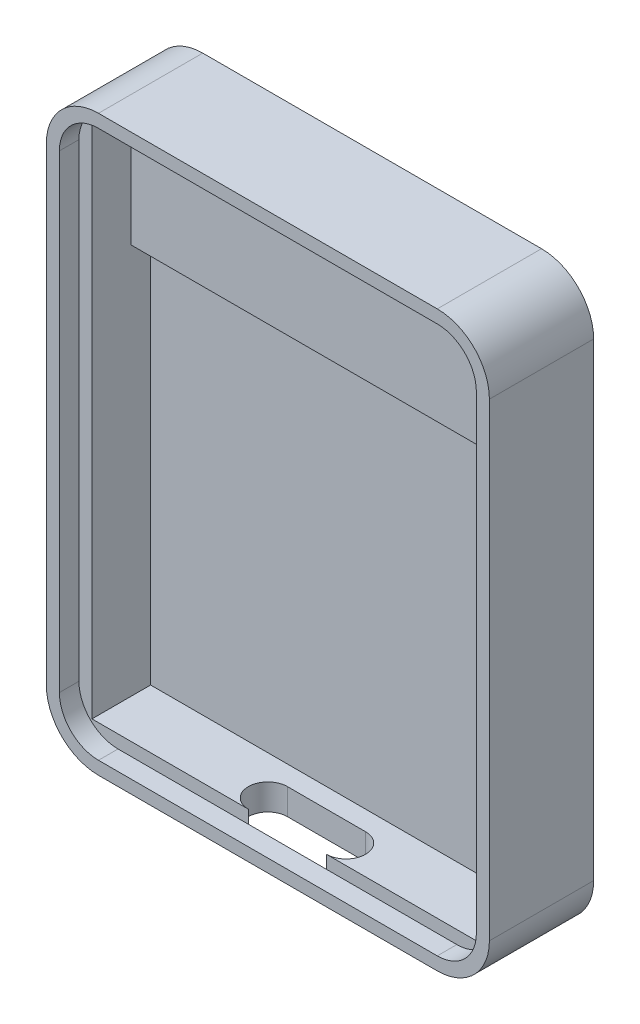
ISO-10303-21;
HEADER;
FILE_DESCRIPTION(('STEP AP214'),'2;1');
FILE_NAME('part.step','',(''),(''),'','','');
FILE_SCHEMA(('AUTOMOTIVE_DESIGN { 1 0 10303 214 1 1 1 1 }'));
ENDSEC;
DATA;
#1=APPLICATION_CONTEXT('core data for automotive mechanical design processes');
#2=APPLICATION_PROTOCOL_DEFINITION('international standard','automotive_design',2000,#1);
#3=PRODUCT_CONTEXT('',#1,'mechanical');
#4=PRODUCT('Part','Part','',(#3));
#5=PRODUCT_RELATED_PRODUCT_CATEGORY('part','',(#4));
#6=PRODUCT_DEFINITION_FORMATION('','',#4);
#7=PRODUCT_DEFINITION_CONTEXT('part definition',#1,'design');
#8=PRODUCT_DEFINITION('design','',#6,#7);
#9=PRODUCT_DEFINITION_SHAPE('','',#8);
#10=(LENGTH_UNIT() NAMED_UNIT(*) SI_UNIT(.MILLI.,.METRE.));
#11=(NAMED_UNIT(*) PLANE_ANGLE_UNIT() SI_UNIT($,.RADIAN.));
#12=(NAMED_UNIT(*) SI_UNIT($,.STERADIAN.) SOLID_ANGLE_UNIT());
#13=UNCERTAINTY_MEASURE_WITH_UNIT(LENGTH_MEASURE(1.E-05),#10,'distance_accuracy_value','');
#14=(GEOMETRIC_REPRESENTATION_CONTEXT(3) GLOBAL_UNCERTAINTY_ASSIGNED_CONTEXT((#13)) GLOBAL_UNIT_ASSIGNED_CONTEXT((#10,
#11,#12)) REPRESENTATION_CONTEXT('',''));
#15=CARTESIAN_POINT('',(0.,0.,0.));
#16=DIRECTION('',(0.,0.,1.));
#17=DIRECTION('',(1.,0.,0.));
#18=AXIS2_PLACEMENT_3D('',#15,#16,#17);
#19=CARTESIAN_POINT('',(17.,22.,8.));
#20=DIRECTION('',(-1.,0.,0.));
#21=DIRECTION('',(0.,-1.,0.));
#22=AXIS2_PLACEMENT_3D('',#19,#20,#21);
#23=PLANE('',#22);
#24=DIRECTION('',(0.,1.,0.));
#25=VECTOR('',#24,1.);
#26=CARTESIAN_POINT('',(17.,22.,8.));
#27=LINE('',#26,#25);
#28=CARTESIAN_POINT('',(17.,-18.,8.));
#29=VERTEX_POINT('',#28);
#30=CARTESIAN_POINT('',(17.,18.,8.));
#31=VERTEX_POINT('',#30);
#32=EDGE_CURVE('E370',#29,#31,#27,.T.);
#33=ORIENTED_EDGE('',*,*,#32,.F.);
#34=DIRECTION('',(0.,0.,-1.));
#35=VECTOR('',#34,1.);
#36=CARTESIAN_POINT('',(17.,-18.,8.));
#37=LINE('',#36,#35);
#38=CARTESIAN_POINT('',(17.,-18.,0.));
#39=VERTEX_POINT('',#38);
#40=EDGE_CURVE('E395',#29,#39,#37,.T.);
#41=ORIENTED_EDGE('',*,*,#40,.T.);
#42=DIRECTION('',(0.,1.,0.));
#43=VECTOR('',#42,1.);
#44=CARTESIAN_POINT('',(17.,22.,0.));
#45=LINE('',#44,#43);
#46=CARTESIAN_POINT('',(17.,18.,0.));
#47=VERTEX_POINT('',#46);
#48=EDGE_CURVE('E361',#39,#47,#45,.T.);
#49=ORIENTED_EDGE('',*,*,#48,.T.);
#50=DIRECTION('',(0.,0.,-1.));
#51=VECTOR('',#50,1.);
#52=CARTESIAN_POINT('',(17.,18.,8.));
#53=LINE('',#52,#51);
#54=EDGE_CURVE('E383',#47,#31,#53,.F.);
#55=ORIENTED_EDGE('',*,*,#54,.T.);
#56=EDGE_LOOP('',(#33,#41,#49,#55));
#57=FACE_BOUND('',#56,.T.);
#58=ADVANCED_FACE('F36',(#57),#23,.F.);
#59=CARTESIAN_POINT('',(-17.,22.,8.));
#60=DIRECTION('',(0.,-1.,0.));
#61=DIRECTION('',(0.,0.,-1.));
#62=AXIS2_PLACEMENT_3D('',#59,#60,#61);
#63=PLANE('',#62);
#64=DIRECTION('',(-1.,0.,0.));
#65=VECTOR('',#64,1.);
#66=CARTESIAN_POINT('',(-17.,22.,8.));
#67=LINE('',#66,#65);
#68=CARTESIAN_POINT('',(13.,22.,8.));
#69=VERTEX_POINT('',#68);
#70=CARTESIAN_POINT('',(-13.,22.,8.));
#71=VERTEX_POINT('',#70);
#72=EDGE_CURVE('E373',#69,#71,#67,.T.);
#73=ORIENTED_EDGE('',*,*,#72,.F.);
#74=DIRECTION('',(0.,0.,-1.));
#75=VECTOR('',#74,1.);
#76=CARTESIAN_POINT('',(13.,22.,8.));
#77=LINE('',#76,#75);
#78=CARTESIAN_POINT('',(13.,22.,0.));
#79=VERTEX_POINT('',#78);
#80=EDGE_CURVE('E421',#69,#79,#77,.T.);
#81=ORIENTED_EDGE('',*,*,#80,.T.);
#82=DIRECTION('',(-1.,0.,0.));
#83=VECTOR('',#82,1.);
#84=CARTESIAN_POINT('',(-17.,22.,0.));
#85=LINE('',#84,#83);
#86=CARTESIAN_POINT('',(-13.,22.,0.));
#87=VERTEX_POINT('',#86);
#88=EDGE_CURVE('E386',#79,#87,#85,.T.);
#89=ORIENTED_EDGE('',*,*,#88,.T.);
#90=DIRECTION('',(0.,0.,-1.));
#91=VECTOR('',#90,1.);
#92=CARTESIAN_POINT('',(-13.,22.,8.));
#93=LINE('',#92,#91);
#94=EDGE_CURVE('E419',#87,#71,#93,.F.);
#95=ORIENTED_EDGE('',*,*,#94,.T.);
#96=EDGE_LOOP('',(#73,#81,#89,#95));
#97=FACE_BOUND('',#96,.T.);
#98=ADVANCED_FACE('F457',(#97),#63,.F.);
#99=CARTESIAN_POINT('',(-17.,22.,8.));
#100=DIRECTION('',(1.,0.,0.));
#101=DIRECTION('',(0.,1.,0.));
#102=AXIS2_PLACEMENT_3D('',#99,#100,#101);
#103=PLANE('',#102);
#104=DIRECTION('',(0.,-1.,0.));
#105=VECTOR('',#104,1.);
#106=CARTESIAN_POINT('',(-17.,22.,8.));
#107=LINE('',#106,#105);
#108=CARTESIAN_POINT('',(-17.,18.,8.));
#109=VERTEX_POINT('',#108);
#110=CARTESIAN_POINT('',(-17.,-18.,8.));
#111=VERTEX_POINT('',#110);
#112=EDGE_CURVE('E377',#109,#111,#107,.T.);
#113=ORIENTED_EDGE('',*,*,#112,.F.);
#114=DIRECTION('',(0.,0.,-1.));
#115=VECTOR('',#114,1.);
#116=CARTESIAN_POINT('',(-17.,18.,8.));
#117=LINE('',#116,#115);
#118=CARTESIAN_POINT('',(-17.,18.,0.));
#119=VERTEX_POINT('',#118);
#120=EDGE_CURVE('E11',#109,#119,#117,.T.);
#121=ORIENTED_EDGE('',*,*,#120,.T.);
#122=DIRECTION('',(0.,-1.,0.));
#123=VECTOR('',#122,1.);
#124=CARTESIAN_POINT('',(-17.,22.,0.));
#125=LINE('',#124,#123);
#126=CARTESIAN_POINT('',(-17.,-18.,0.));
#127=VERTEX_POINT('',#126);
#128=EDGE_CURVE('E389',#119,#127,#125,.T.);
#129=ORIENTED_EDGE('',*,*,#128,.T.);
#130=DIRECTION('',(0.,0.,-1.));
#131=VECTOR('',#130,1.);
#132=CARTESIAN_POINT('',(-17.,-18.,8.));
#133=LINE('',#132,#131);
#134=EDGE_CURVE('E44',#127,#111,#133,.F.);
#135=ORIENTED_EDGE('',*,*,#134,.T.);
#136=EDGE_LOOP('',(#113,#121,#129,#135));
#137=FACE_BOUND('',#136,.T.);
#138=ADVANCED_FACE('F426',(#137),#103,.F.);
#139=CARTESIAN_POINT('',(-17.,-22.,8.));
#140=DIRECTION('',(0.,1.,0.));
#141=DIRECTION('',(0.,0.,1.));
#142=AXIS2_PLACEMENT_3D('',#139,#140,#141);
#143=PLANE('',#142);
#144=DIRECTION('',(1.,0.,0.));
#145=VECTOR('',#144,1.);
#146=CARTESIAN_POINT('',(-3.,-22.,3.5));
#147=LINE('',#146,#145);
#148=CARTESIAN_POINT('',(-3.,-22.,3.5));
#149=VERTEX_POINT('',#148);
#150=CARTESIAN_POINT('',(3.,-22.,3.5));
#151=VERTEX_POINT('',#150);
#152=EDGE_CURVE('E312',#149,#151,#147,.T.);
#153=ORIENTED_EDGE('',*,*,#152,.F.);
#154=CARTESIAN_POINT('',(-3.,-22.,5.));
#155=DIRECTION('',(0.,-1.,0.));
#156=DIRECTION('',(0.,0.,-1.));
#157=AXIS2_PLACEMENT_3D('',#154,#155,#156);
#158=CIRCLE('',#157,1.5);
#159=CARTESIAN_POINT('',(-3.,-22.,6.5));
#160=VERTEX_POINT('',#159);
#161=EDGE_CURVE('E59',#160,#149,#158,.T.);
#162=ORIENTED_EDGE('',*,*,#161,.F.);
#163=DIRECTION('',(-1.,0.,0.));
#164=VECTOR('',#163,1.);
#165=CARTESIAN_POINT('',(-3.,-22.,6.5));
#166=LINE('',#165,#164);
#167=CARTESIAN_POINT('',(3.,-22.,6.5));
#168=VERTEX_POINT('',#167);
#169=EDGE_CURVE('E304',#168,#160,#166,.T.);
#170=ORIENTED_EDGE('',*,*,#169,.F.);
#171=CARTESIAN_POINT('',(3.,-22.,5.));
#172=DIRECTION('',(0.,-1.,0.));
#173=DIRECTION('',(0.,0.,-1.));
#174=AXIS2_PLACEMENT_3D('',#171,#172,#173);
#175=CIRCLE('',#174,1.5);
#176=EDGE_CURVE('E315',#151,#168,#175,.T.);
#177=ORIENTED_EDGE('',*,*,#176,.F.);
#178=EDGE_LOOP('',(#153,#162,#170,#177));
#179=FACE_BOUND('',#178,.T.);
#180=DIRECTION('',(1.,0.,0.));
#181=VECTOR('',#180,1.);
#182=CARTESIAN_POINT('',(-17.,-22.,0.));
#183=LINE('',#182,#181);
#184=CARTESIAN_POINT('',(-13.,-22.,0.));
#185=VERTEX_POINT('',#184);
#186=CARTESIAN_POINT('',(13.,-22.,0.));
#187=VERTEX_POINT('',#186);
#188=EDGE_CURVE('E374',#185,#187,#183,.T.);
#189=ORIENTED_EDGE('',*,*,#188,.T.);
#190=DIRECTION('',(0.,0.,-1.));
#191=VECTOR('',#190,1.);
#192=CARTESIAN_POINT('',(13.,-22.,8.));
#193=LINE('',#192,#191);
#194=CARTESIAN_POINT('',(13.,-22.,8.));
#195=VERTEX_POINT('',#194);
#196=EDGE_CURVE('E409',#187,#195,#193,.F.);
#197=ORIENTED_EDGE('',*,*,#196,.T.);
#198=DIRECTION('',(1.,0.,0.));
#199=VECTOR('',#198,1.);
#200=CARTESIAN_POINT('',(-17.,-22.,8.));
#201=LINE('',#200,#199);
#202=CARTESIAN_POINT('',(-13.,-22.,8.));
#203=VERTEX_POINT('',#202);
#204=EDGE_CURVE('E380',#203,#195,#201,.T.);
#205=ORIENTED_EDGE('',*,*,#204,.F.);
#206=DIRECTION('',(0.,0.,-1.));
#207=VECTOR('',#206,1.);
#208=CARTESIAN_POINT('',(-13.,-22.,8.));
#209=LINE('',#208,#207);
#210=EDGE_CURVE('E406',#203,#185,#209,.T.);
#211=ORIENTED_EDGE('',*,*,#210,.T.);
#212=EDGE_LOOP('',(#189,#197,#205,#211));
#213=FACE_BOUND('',#212,.T.);
#214=ADVANCED_FACE('F438',(#179,#213),#143,.F.);
#215=CARTESIAN_POINT('',(0.,0.,8.));
#216=DIRECTION('',(0.,0.,1.));
#217=DIRECTION('',(1.,0.,0.));
#218=AXIS2_PLACEMENT_3D('',#215,#216,#217);
#219=PLANE('',#218);
#220=CARTESIAN_POINT('',(13.,18.,8.));
#221=DIRECTION('',(0.,0.,1.));
#222=DIRECTION('',(-1.,0.,0.));
#223=AXIS2_PLACEMENT_3D('',#220,#221,#222);
#224=CIRCLE('',#223,3.);
#225=CARTESIAN_POINT('',(16.,18.,8.));
#226=VERTEX_POINT('',#225);
#227=CARTESIAN_POINT('',(13.,21.,8.));
#228=VERTEX_POINT('',#227);
#229=EDGE_CURVE('E51',#226,#228,#224,.T.);
#230=ORIENTED_EDGE('',*,*,#229,.F.);
#231=DIRECTION('',(0.,1.,0.));
#232=VECTOR('',#231,1.);
#233=CARTESIAN_POINT('',(16.,-18.,8.));
#234=LINE('',#233,#232);
#235=CARTESIAN_POINT('',(16.,-18.,8.));
#236=VERTEX_POINT('',#235);
#237=EDGE_CURVE('E236',#236,#226,#234,.T.);
#238=ORIENTED_EDGE('',*,*,#237,.F.);
#239=CARTESIAN_POINT('',(13.,-18.,8.));
#240=DIRECTION('',(0.,0.,1.));
#241=DIRECTION('',(1.,0.,0.));
#242=AXIS2_PLACEMENT_3D('',#239,#240,#241);
#243=CIRCLE('',#242,3.);
#244=CARTESIAN_POINT('',(13.,-21.,8.));
#245=VERTEX_POINT('',#244);
#246=EDGE_CURVE('E239',#245,#236,#243,.T.);
#247=ORIENTED_EDGE('',*,*,#246,.F.);
#248=DIRECTION('',(1.,0.,0.));
#249=VECTOR('',#248,1.);
#250=CARTESIAN_POINT('',(-13.,-21.,8.));
#251=LINE('',#250,#249);
#252=CARTESIAN_POINT('',(-13.,-21.,8.));
#253=VERTEX_POINT('',#252);
#254=EDGE_CURVE('E269',#253,#245,#251,.T.);
#255=ORIENTED_EDGE('',*,*,#254,.F.);
#256=CARTESIAN_POINT('',(-13.,-18.,8.));
#257=DIRECTION('',(0.,0.,1.));
#258=DIRECTION('',(-1.,0.,0.));
#259=AXIS2_PLACEMENT_3D('',#256,#257,#258);
#260=CIRCLE('',#259,3.);
#261=CARTESIAN_POINT('',(-16.,-18.,8.));
#262=VERTEX_POINT('',#261);
#263=EDGE_CURVE('E266',#262,#253,#260,.T.);
#264=ORIENTED_EDGE('',*,*,#263,.F.);
#265=DIRECTION('',(0.,-1.,0.));
#266=VECTOR('',#265,1.);
#267=CARTESIAN_POINT('',(-16.,-18.,8.));
#268=LINE('',#267,#266);
#269=CARTESIAN_POINT('',(-16.,18.,8.));
#270=VERTEX_POINT('',#269);
#271=EDGE_CURVE('E263',#270,#262,#268,.T.);
#272=ORIENTED_EDGE('',*,*,#271,.F.);
#273=CARTESIAN_POINT('',(-13.,18.,8.));
#274=DIRECTION('',(0.,0.,1.));
#275=DIRECTION('',(1.,0.,0.));
#276=AXIS2_PLACEMENT_3D('',#273,#274,#275);
#277=CIRCLE('',#276,3.);
#278=CARTESIAN_POINT('',(-13.,21.,8.));
#279=VERTEX_POINT('',#278);
#280=EDGE_CURVE('E260',#279,#270,#277,.T.);
#281=ORIENTED_EDGE('',*,*,#280,.F.);
#282=DIRECTION('',(-1.,0.,0.));
#283=VECTOR('',#282,1.);
#284=CARTESIAN_POINT('',(-13.,21.,8.));
#285=LINE('',#284,#283);
#286=EDGE_CURVE('E258',#228,#279,#285,.T.);
#287=ORIENTED_EDGE('',*,*,#286,.F.);
#288=EDGE_LOOP('',(#230,#238,#247,#255,#264,#272,#281,#287));
#289=FACE_BOUND('',#288,.T.);
#290=ORIENTED_EDGE('',*,*,#204,.T.);
#291=CARTESIAN_POINT('',(13.,-18.,8.));
#292=DIRECTION('',(0.,0.,1.));
#293=DIRECTION('',(1.,0.,0.));
#294=AXIS2_PLACEMENT_3D('',#291,#292,#293);
#295=CIRCLE('',#294,4.);
#296=EDGE_CURVE('E417',#195,#29,#295,.T.);
#297=ORIENTED_EDGE('',*,*,#296,.T.);
#298=ORIENTED_EDGE('',*,*,#32,.T.);
#299=CARTESIAN_POINT('',(13.,18.,8.));
#300=DIRECTION('',(0.,0.,1.));
#301=DIRECTION('',(1.,0.,0.));
#302=AXIS2_PLACEMENT_3D('',#299,#300,#301);
#303=CIRCLE('',#302,4.);
#304=EDGE_CURVE('E415',#31,#69,#303,.T.);
#305=ORIENTED_EDGE('',*,*,#304,.T.);
#306=ORIENTED_EDGE('',*,*,#72,.T.);
#307=CARTESIAN_POINT('',(-13.,18.,8.));
#308=DIRECTION('',(0.,0.,1.));
#309=DIRECTION('',(1.,0.,0.));
#310=AXIS2_PLACEMENT_3D('',#307,#308,#309);
#311=CIRCLE('',#310,4.);
#312=EDGE_CURVE('E413',#71,#109,#311,.T.);
#313=ORIENTED_EDGE('',*,*,#312,.T.);
#314=ORIENTED_EDGE('',*,*,#112,.T.);
#315=CARTESIAN_POINT('',(-13.,-18.,8.));
#316=DIRECTION('',(0.,0.,1.));
#317=DIRECTION('',(1.,0.,0.));
#318=AXIS2_PLACEMENT_3D('',#315,#316,#317);
#319=CIRCLE('',#318,4.);
#320=EDGE_CURVE('E411',#111,#203,#319,.T.);
#321=ORIENTED_EDGE('',*,*,#320,.T.);
#322=EDGE_LOOP('',(#290,#297,#298,#305,#306,#313,#314,#321));
#323=FACE_BOUND('',#322,.T.);
#324=ADVANCED_FACE('F432',(#289,#323),#219,.T.);
#325=CARTESIAN_POINT('',(0.,0.,0.));
#326=DIRECTION('',(0.,0.,1.));
#327=DIRECTION('',(1.,0.,0.));
#328=AXIS2_PLACEMENT_3D('',#325,#326,#327);
#329=PLANE('',#328);
#330=ORIENTED_EDGE('',*,*,#48,.F.);
#331=CARTESIAN_POINT('',(13.,-18.,0.));
#332=DIRECTION('',(0.,0.,1.));
#333=DIRECTION('',(1.,0.,0.));
#334=AXIS2_PLACEMENT_3D('',#331,#332,#333);
#335=CIRCLE('',#334,4.);
#336=EDGE_CURVE('E404',#39,#187,#335,.F.);
#337=ORIENTED_EDGE('',*,*,#336,.T.);
#338=ORIENTED_EDGE('',*,*,#188,.F.);
#339=CARTESIAN_POINT('',(-13.,-18.,0.));
#340=DIRECTION('',(0.,0.,1.));
#341=DIRECTION('',(1.,0.,0.));
#342=AXIS2_PLACEMENT_3D('',#339,#340,#341);
#343=CIRCLE('',#342,4.);
#344=EDGE_CURVE('E398',#185,#127,#343,.F.);
#345=ORIENTED_EDGE('',*,*,#344,.T.);
#346=ORIENTED_EDGE('',*,*,#128,.F.);
#347=CARTESIAN_POINT('',(-13.,18.,0.));
#348=DIRECTION('',(0.,0.,1.));
#349=DIRECTION('',(1.,0.,0.));
#350=AXIS2_PLACEMENT_3D('',#347,#348,#349);
#351=CIRCLE('',#350,4.);
#352=EDGE_CURVE('E400',#119,#87,#351,.F.);
#353=ORIENTED_EDGE('',*,*,#352,.T.);
#354=ORIENTED_EDGE('',*,*,#88,.F.);
#355=CARTESIAN_POINT('',(13.,18.,0.));
#356=DIRECTION('',(0.,0.,1.));
#357=DIRECTION('',(1.,0.,0.));
#358=AXIS2_PLACEMENT_3D('',#355,#356,#357);
#359=CIRCLE('',#358,4.);
#360=EDGE_CURVE('E402',#79,#47,#359,.F.);
#361=ORIENTED_EDGE('',*,*,#360,.T.);
#362=EDGE_LOOP('',(#330,#337,#338,#345,#346,#353,#354,#361));
#363=FACE_BOUND('',#362,.T.);
#364=ADVANCED_FACE('F442',(#363),#329,.F.);
#365=CARTESIAN_POINT('',(15.,20.,3.5));
#366=DIRECTION('',(1.,0.,0.));
#367=DIRECTION('',(0.,1.,0.));
#368=AXIS2_PLACEMENT_3D('',#365,#366,#367);
#369=PLANE('',#368);
#370=DIRECTION('',(0.,0.,1.));
#371=VECTOR('',#370,1.);
#372=CARTESIAN_POINT('',(15.,-20.,3.5));
#373=LINE('',#372,#371);
#374=CARTESIAN_POINT('',(15.,-20.,2.));
#375=VERTEX_POINT('',#374);
#376=CARTESIAN_POINT('',(15.,-20.,6.5));
#377=VERTEX_POINT('',#376);
#378=EDGE_CURVE('E358',#375,#377,#373,.T.);
#379=ORIENTED_EDGE('',*,*,#378,.T.);
#380=DIRECTION('',(0.,1.,0.));
#381=VECTOR('',#380,1.);
#382=CARTESIAN_POINT('',(15.,20.,6.5));
#383=LINE('',#382,#381);
#384=CARTESIAN_POINT('',(15.,20.,6.5));
#385=VERTEX_POINT('',#384);
#386=EDGE_CURVE('E290',#377,#385,#383,.T.);
#387=ORIENTED_EDGE('',*,*,#386,.T.);
#388=DIRECTION('',(0.,0.,1.));
#389=VECTOR('',#388,1.);
#390=CARTESIAN_POINT('',(15.,20.,3.5));
#391=LINE('',#390,#389);
#392=CARTESIAN_POINT('',(15.,20.,3.5));
#393=VERTEX_POINT('',#392);
#394=EDGE_CURVE('E357',#393,#385,#391,.T.);
#395=ORIENTED_EDGE('',*,*,#394,.F.);
#396=DIRECTION('',(0.,1.,0.));
#397=VECTOR('',#396,1.);
#398=CARTESIAN_POINT('',(15.,20.,3.5));
#399=LINE('',#398,#397);
#400=CARTESIAN_POINT('',(15.,10.,3.5));
#401=VERTEX_POINT('',#400);
#402=EDGE_CURVE('E348',#401,#393,#399,.T.);
#403=ORIENTED_EDGE('',*,*,#402,.F.);
#404=DIRECTION('',(0.,0.,1.));
#405=VECTOR('',#404,1.);
#406=CARTESIAN_POINT('',(15.,10.,2.));
#407=LINE('',#406,#405);
#408=CARTESIAN_POINT('',(15.,10.,2.));
#409=VERTEX_POINT('',#408);
#410=EDGE_CURVE('E343',#409,#401,#407,.T.);
#411=ORIENTED_EDGE('',*,*,#410,.F.);
#412=DIRECTION('',(0.,1.,0.));
#413=VECTOR('',#412,1.);
#414=CARTESIAN_POINT('',(15.,10.,2.));
#415=LINE('',#414,#413);
#416=EDGE_CURVE('E337',#375,#409,#415,.T.);
#417=ORIENTED_EDGE('',*,*,#416,.F.);
#418=EDGE_LOOP('',(#379,#387,#395,#403,#411,#417));
#419=FACE_BOUND('',#418,.T.);
#420=ADVANCED_FACE('F501',(#419),#369,.F.);
#421=CARTESIAN_POINT('',(-15.,-20.,3.5));
#422=DIRECTION('',(0.,-1.,0.));
#423=DIRECTION('',(0.,0.,-1.));
#424=AXIS2_PLACEMENT_3D('',#421,#422,#423);
#425=PLANE('',#424);
#426=DIRECTION('',(0.,0.,1.));
#427=VECTOR('',#426,1.);
#428=CARTESIAN_POINT('',(-15.,-20.,3.5));
#429=LINE('',#428,#427);
#430=CARTESIAN_POINT('',(-15.,-20.,2.));
#431=VERTEX_POINT('',#430);
#432=CARTESIAN_POINT('',(-15.,-20.,6.5));
#433=VERTEX_POINT('',#432);
#434=EDGE_CURVE('E362',#431,#433,#429,.T.);
#435=ORIENTED_EDGE('',*,*,#434,.T.);
#436=DIRECTION('',(1.,0.,0.));
#437=VECTOR('',#436,1.);
#438=CARTESIAN_POINT('',(-15.,-20.,6.5));
#439=LINE('',#438,#437);
#440=CARTESIAN_POINT('',(-3.,-20.,6.5));
#441=VERTEX_POINT('',#440);
#442=EDGE_CURVE('E291',#433,#441,#439,.T.);
#443=ORIENTED_EDGE('',*,*,#442,.T.);
#444=CARTESIAN_POINT('',(-3.,-20.,5.));
#445=DIRECTION('',(0.,-1.,0.));
#446=DIRECTION('',(0.,0.,-1.));
#447=AXIS2_PLACEMENT_3D('',#444,#445,#446);
#448=CIRCLE('',#447,1.5);
#449=CARTESIAN_POINT('',(-3.,-20.,3.5));
#450=VERTEX_POINT('',#449);
#451=EDGE_CURVE('E300',#441,#450,#448,.T.);
#452=ORIENTED_EDGE('',*,*,#451,.T.);
#453=DIRECTION('',(1.,0.,0.));
#454=VECTOR('',#453,1.);
#455=CARTESIAN_POINT('',(-3.,-20.,3.5));
#456=LINE('',#455,#454);
#457=CARTESIAN_POINT('',(3.,-20.,3.5));
#458=VERTEX_POINT('',#457);
#459=EDGE_CURVE('E303',#450,#458,#456,.T.);
#460=ORIENTED_EDGE('',*,*,#459,.T.);
#461=CARTESIAN_POINT('',(3.,-20.,5.));
#462=DIRECTION('',(0.,-1.,0.));
#463=DIRECTION('',(0.,0.,-1.));
#464=AXIS2_PLACEMENT_3D('',#461,#462,#463);
#465=CIRCLE('',#464,1.5);
#466=CARTESIAN_POINT('',(3.,-20.,6.5));
#467=VERTEX_POINT('',#466);
#468=EDGE_CURVE('E307',#458,#467,#465,.T.);
#469=ORIENTED_EDGE('',*,*,#468,.T.);
#470=EDGE_CURVE('E276',#467,#377,#439,.T.);
#471=ORIENTED_EDGE('',*,*,#470,.T.);
#472=ORIENTED_EDGE('',*,*,#378,.F.);
#473=DIRECTION('',(1.,0.,0.));
#474=VECTOR('',#473,1.);
#475=CARTESIAN_POINT('',(15.,-20.,2.));
#476=LINE('',#475,#474);
#477=EDGE_CURVE('E334',#431,#375,#476,.T.);
#478=ORIENTED_EDGE('',*,*,#477,.F.);
#479=EDGE_LOOP('',(#435,#443,#452,#460,#469,#471,#472,#478));
#480=FACE_BOUND('',#479,.T.);
#481=ADVANCED_FACE('F497',(#480),#425,.F.);
#482=CARTESIAN_POINT('',(-15.,20.,3.5));
#483=DIRECTION('',(-1.,0.,0.));
#484=DIRECTION('',(0.,-1.,0.));
#485=AXIS2_PLACEMENT_3D('',#482,#483,#484);
#486=PLANE('',#485);
#487=DIRECTION('',(0.,0.,1.));
#488=VECTOR('',#487,1.);
#489=CARTESIAN_POINT('',(-15.,20.,3.5));
#490=LINE('',#489,#488);
#491=CARTESIAN_POINT('',(-15.,20.,3.5));
#492=VERTEX_POINT('',#491);
#493=CARTESIAN_POINT('',(-15.,20.,6.5));
#494=VERTEX_POINT('',#493);
#495=EDGE_CURVE('E365',#492,#494,#490,.T.);
#496=ORIENTED_EDGE('',*,*,#495,.T.);
#497=DIRECTION('',(0.,-1.,0.));
#498=VECTOR('',#497,1.);
#499=CARTESIAN_POINT('',(-15.,20.,6.5));
#500=LINE('',#499,#498);
#501=EDGE_CURVE('E297',#494,#433,#500,.T.);
#502=ORIENTED_EDGE('',*,*,#501,.T.);
#503=ORIENTED_EDGE('',*,*,#434,.F.);
#504=DIRECTION('',(0.,-1.,0.));
#505=VECTOR('',#504,1.);
#506=CARTESIAN_POINT('',(-15.,10.,2.));
#507=LINE('',#506,#505);
#508=CARTESIAN_POINT('',(-15.,10.,2.));
#509=VERTEX_POINT('',#508);
#510=EDGE_CURVE('E331',#509,#431,#507,.T.);
#511=ORIENTED_EDGE('',*,*,#510,.F.);
#512=DIRECTION('',(0.,0.,1.));
#513=VECTOR('',#512,1.);
#514=CARTESIAN_POINT('',(-15.,10.,2.));
#515=LINE('',#514,#513);
#516=CARTESIAN_POINT('',(-15.,10.,3.5));
#517=VERTEX_POINT('',#516);
#518=EDGE_CURVE('E346',#509,#517,#515,.T.);
#519=ORIENTED_EDGE('',*,*,#518,.T.);
#520=DIRECTION('',(0.,-1.,0.));
#521=VECTOR('',#520,1.);
#522=CARTESIAN_POINT('',(-15.,20.,3.5));
#523=LINE('',#522,#521);
#524=EDGE_CURVE('E354',#492,#517,#523,.T.);
#525=ORIENTED_EDGE('',*,*,#524,.F.);
#526=EDGE_LOOP('',(#496,#502,#503,#511,#519,#525));
#527=FACE_BOUND('',#526,.T.);
#528=ADVANCED_FACE('F500',(#527),#486,.F.);
#529=CARTESIAN_POINT('',(-15.,20.,3.5));
#530=DIRECTION('',(0.,1.,0.));
#531=DIRECTION('',(0.,0.,1.));
#532=AXIS2_PLACEMENT_3D('',#529,#530,#531);
#533=PLANE('',#532);
#534=ORIENTED_EDGE('',*,*,#394,.T.);
#535=DIRECTION('',(-1.,0.,0.));
#536=VECTOR('',#535,1.);
#537=CARTESIAN_POINT('',(-15.,20.,6.5));
#538=LINE('',#537,#536);
#539=EDGE_CURVE('E294',#385,#494,#538,.T.);
#540=ORIENTED_EDGE('',*,*,#539,.T.);
#541=ORIENTED_EDGE('',*,*,#495,.F.);
#542=DIRECTION('',(-1.,0.,0.));
#543=VECTOR('',#542,1.);
#544=CARTESIAN_POINT('',(-15.,20.,3.5));
#545=LINE('',#544,#543);
#546=EDGE_CURVE('E351',#393,#492,#545,.T.);
#547=ORIENTED_EDGE('',*,*,#546,.F.);
#548=EDGE_LOOP('',(#534,#540,#541,#547));
#549=FACE_BOUND('',#548,.T.);
#550=ADVANCED_FACE('F495',(#549),#533,.F.);
#551=CARTESIAN_POINT('',(0.,0.,3.5));
#552=DIRECTION('',(0.,0.,1.));
#553=DIRECTION('',(1.,0.,0.));
#554=AXIS2_PLACEMENT_3D('',#551,#552,#553);
#555=PLANE('',#554);
#556=DIRECTION('',(-1.,0.,0.));
#557=VECTOR('',#556,1.);
#558=CARTESIAN_POINT('',(15.,10.,3.5));
#559=LINE('',#558,#557);
#560=EDGE_CURVE('E323',#401,#517,#559,.T.);
#561=ORIENTED_EDGE('',*,*,#560,.F.);
#562=ORIENTED_EDGE('',*,*,#402,.T.);
#563=ORIENTED_EDGE('',*,*,#546,.T.);
#564=ORIENTED_EDGE('',*,*,#524,.T.);
#565=EDGE_LOOP('',(#561,#562,#563,#564));
#566=FACE_BOUND('',#565,.T.);
#567=ADVANCED_FACE('F487',(#566),#555,.T.);
#568=CARTESIAN_POINT('',(15.,10.,2.));
#569=DIRECTION('',(0.,1.,0.));
#570=DIRECTION('',(0.,0.,1.));
#571=AXIS2_PLACEMENT_3D('',#568,#569,#570);
#572=PLANE('',#571);
#573=ORIENTED_EDGE('',*,*,#560,.T.);
#574=ORIENTED_EDGE('',*,*,#518,.F.);
#575=DIRECTION('',(-1.,0.,0.));
#576=VECTOR('',#575,1.);
#577=CARTESIAN_POINT('',(15.,10.,2.));
#578=LINE('',#577,#576);
#579=EDGE_CURVE('E340',#409,#509,#578,.T.);
#580=ORIENTED_EDGE('',*,*,#579,.F.);
#581=ORIENTED_EDGE('',*,*,#410,.T.);
#582=EDGE_LOOP('',(#573,#574,#580,#581));
#583=FACE_BOUND('',#582,.T.);
#584=ADVANCED_FACE('F481',(#583),#572,.F.);
#585=CARTESIAN_POINT('',(0.,0.,2.));
#586=DIRECTION('',(0.,0.,-1.));
#587=DIRECTION('',(-1.,0.,0.));
#588=AXIS2_PLACEMENT_3D('',#585,#586,#587);
#589=PLANE('',#588);
#590=ORIENTED_EDGE('',*,*,#510,.T.);
#591=ORIENTED_EDGE('',*,*,#477,.T.);
#592=ORIENTED_EDGE('',*,*,#416,.T.);
#593=ORIENTED_EDGE('',*,*,#579,.T.);
#594=EDGE_LOOP('',(#590,#591,#592,#593));
#595=FACE_BOUND('',#594,.T.);
#596=ADVANCED_FACE('F477',(#595),#589,.F.);
#597=CARTESIAN_POINT('',(13.,-18.,8.));
#598=DIRECTION('',(0.,0.,-1.));
#599=DIRECTION('',(-1.,0.,0.));
#600=AXIS2_PLACEMENT_3D('',#597,#598,#599);
#601=CYLINDRICAL_SURFACE('',#600,4.);
#602=ORIENTED_EDGE('',*,*,#296,.F.);
#603=ORIENTED_EDGE('',*,*,#196,.F.);
#604=ORIENTED_EDGE('',*,*,#336,.F.);
#605=ORIENTED_EDGE('',*,*,#40,.F.);
#606=EDGE_LOOP('',(#602,#603,#604,#605));
#607=FACE_BOUND('',#606,.T.);
#608=ADVANCED_FACE('F446',(#607),#601,.T.);
#609=CARTESIAN_POINT('',(13.,18.,8.));
#610=DIRECTION('',(0.,0.,-1.));
#611=DIRECTION('',(-1.,0.,0.));
#612=AXIS2_PLACEMENT_3D('',#609,#610,#611);
#613=CYLINDRICAL_SURFACE('',#612,4.);
#614=ORIENTED_EDGE('',*,*,#304,.F.);
#615=ORIENTED_EDGE('',*,*,#54,.F.);
#616=ORIENTED_EDGE('',*,*,#360,.F.);
#617=ORIENTED_EDGE('',*,*,#80,.F.);
#618=EDGE_LOOP('',(#614,#615,#616,#617));
#619=FACE_BOUND('',#618,.T.);
#620=ADVANCED_FACE('F454',(#619),#613,.T.);
#621=CARTESIAN_POINT('',(-13.,18.,8.));
#622=DIRECTION('',(0.,0.,-1.));
#623=DIRECTION('',(-1.,0.,0.));
#624=AXIS2_PLACEMENT_3D('',#621,#622,#623);
#625=CYLINDRICAL_SURFACE('',#624,4.);
#626=ORIENTED_EDGE('',*,*,#312,.F.);
#627=ORIENTED_EDGE('',*,*,#94,.F.);
#628=ORIENTED_EDGE('',*,*,#352,.F.);
#629=ORIENTED_EDGE('',*,*,#120,.F.);
#630=EDGE_LOOP('',(#626,#627,#628,#629));
#631=FACE_BOUND('',#630,.T.);
#632=ADVANCED_FACE('F460',(#631),#625,.T.);
#633=CARTESIAN_POINT('',(-13.,-18.,8.));
#634=DIRECTION('',(0.,0.,-1.));
#635=DIRECTION('',(-1.,0.,0.));
#636=AXIS2_PLACEMENT_3D('',#633,#634,#635);
#637=CYLINDRICAL_SURFACE('',#636,4.);
#638=ORIENTED_EDGE('',*,*,#320,.F.);
#639=ORIENTED_EDGE('',*,*,#134,.F.);
#640=ORIENTED_EDGE('',*,*,#344,.F.);
#641=ORIENTED_EDGE('',*,*,#210,.F.);
#642=EDGE_LOOP('',(#638,#639,#640,#641));
#643=FACE_BOUND('',#642,.T.);
#644=ADVANCED_FACE('F38',(#643),#637,.T.);
#645=CARTESIAN_POINT('',(-3.,-20.,5.));
#646=DIRECTION('',(0.,-1.,0.));
#647=DIRECTION('',(0.,0.,-1.));
#648=AXIS2_PLACEMENT_3D('',#645,#646,#647);
#649=CYLINDRICAL_SURFACE('',#648,1.5);
#650=ORIENTED_EDGE('',*,*,#161,.T.);
#651=DIRECTION('',(0.,-1.,0.));
#652=VECTOR('',#651,1.);
#653=CARTESIAN_POINT('',(-3.,-20.,3.5));
#654=LINE('',#653,#652);
#655=EDGE_CURVE('E310',#450,#149,#654,.T.);
#656=ORIENTED_EDGE('',*,*,#655,.F.);
#657=ORIENTED_EDGE('',*,*,#451,.F.);
#658=DIRECTION('',(0.,-1.,0.));
#659=VECTOR('',#658,1.);
#660=CARTESIAN_POINT('',(-3.,-20.,6.5));
#661=LINE('',#660,#659);
#662=CARTESIAN_POINT('',(-3.,-21.,6.5));
#663=VERTEX_POINT('',#662);
#664=EDGE_CURVE('E320',#441,#663,#661,.T.);
#665=ORIENTED_EDGE('',*,*,#664,.T.);
#666=EDGE_CURVE('E324',#663,#160,#661,.T.);
#667=ORIENTED_EDGE('',*,*,#666,.T.);
#668=EDGE_LOOP('',(#650,#656,#657,#665,#667));
#669=FACE_BOUND('',#668,.T.);
#670=ADVANCED_FACE('F466',(#669),#649,.F.);
#671=CARTESIAN_POINT('',(-3.,-20.,6.5));
#672=DIRECTION('',(0.,0.,1.));
#673=DIRECTION('',(1.,0.,0.));
#674=AXIS2_PLACEMENT_3D('',#671,#672,#673);
#675=PLANE('',#674);
#676=ORIENTED_EDGE('',*,*,#666,.F.);
#677=DIRECTION('',(1.,0.,0.));
#678=VECTOR('',#677,1.);
#679=CARTESIAN_POINT('',(-13.,-21.,6.5));
#680=LINE('',#679,#678);
#681=CARTESIAN_POINT('',(3.,-21.,6.5));
#682=VERTEX_POINT('',#681);
#683=EDGE_CURVE('E254',#663,#682,#680,.T.);
#684=ORIENTED_EDGE('',*,*,#683,.T.);
#685=DIRECTION('',(0.,-1.,0.));
#686=VECTOR('',#685,1.);
#687=CARTESIAN_POINT('',(3.,-20.,6.5));
#688=LINE('',#687,#686);
#689=EDGE_CURVE('E327',#682,#168,#688,.T.);
#690=ORIENTED_EDGE('',*,*,#689,.T.);
#691=ORIENTED_EDGE('',*,*,#169,.T.);
#692=EDGE_LOOP('',(#676,#684,#690,#691));
#693=FACE_BOUND('',#692,.T.);
#694=ADVANCED_FACE('F628',(#693),#675,.F.);
#695=CARTESIAN_POINT('',(3.,-20.,5.));
#696=DIRECTION('',(0.,-1.,0.));
#697=DIRECTION('',(0.,0.,-1.));
#698=AXIS2_PLACEMENT_3D('',#695,#696,#697);
#699=CYLINDRICAL_SURFACE('',#698,1.5);
#700=ORIENTED_EDGE('',*,*,#176,.T.);
#701=ORIENTED_EDGE('',*,*,#689,.F.);
#702=EDGE_CURVE('E325',#467,#682,#688,.T.);
#703=ORIENTED_EDGE('',*,*,#702,.F.);
#704=ORIENTED_EDGE('',*,*,#468,.F.);
#705=DIRECTION('',(0.,-1.,0.));
#706=VECTOR('',#705,1.);
#707=CARTESIAN_POINT('',(3.,-20.,3.5));
#708=LINE('',#707,#706);
#709=EDGE_CURVE('E328',#458,#151,#708,.T.);
#710=ORIENTED_EDGE('',*,*,#709,.T.);
#711=EDGE_LOOP('',(#700,#701,#703,#704,#710));
#712=FACE_BOUND('',#711,.T.);
#713=ADVANCED_FACE('F635',(#712),#699,.F.);
#714=CARTESIAN_POINT('',(-3.,-20.,3.5));
#715=DIRECTION('',(0.,0.,-1.));
#716=DIRECTION('',(-1.,0.,0.));
#717=AXIS2_PLACEMENT_3D('',#714,#715,#716);
#718=PLANE('',#717);
#719=ORIENTED_EDGE('',*,*,#152,.T.);
#720=ORIENTED_EDGE('',*,*,#709,.F.);
#721=ORIENTED_EDGE('',*,*,#459,.F.);
#722=ORIENTED_EDGE('',*,*,#655,.T.);
#723=EDGE_LOOP('',(#719,#720,#721,#722));
#724=FACE_BOUND('',#723,.T.);
#725=ADVANCED_FACE('F644',(#724),#718,.F.);
#726=CARTESIAN_POINT('',(13.,18.,6.5));
#727=DIRECTION('',(0.,0.,1.));
#728=DIRECTION('',(1.,0.,0.));
#729=AXIS2_PLACEMENT_3D('',#726,#727,#728);
#730=CYLINDRICAL_SURFACE('',#729,3.);
#731=ORIENTED_EDGE('',*,*,#229,.T.);
#732=DIRECTION('',(0.,0.,1.));
#733=VECTOR('',#732,1.);
#734=CARTESIAN_POINT('',(13.,21.,6.5));
#735=LINE('',#734,#733);
#736=CARTESIAN_POINT('',(13.,21.,6.5));
#737=VERTEX_POINT('',#736);
#738=EDGE_CURVE('E213',#737,#228,#735,.T.);
#739=ORIENTED_EDGE('',*,*,#738,.F.);
#740=CARTESIAN_POINT('',(13.,18.,6.5));
#741=DIRECTION('',(0.,0.,1.));
#742=DIRECTION('',(-1.,0.,0.));
#743=AXIS2_PLACEMENT_3D('',#740,#741,#742);
#744=CIRCLE('',#743,3.);
#745=CARTESIAN_POINT('',(16.,18.,6.5));
#746=VERTEX_POINT('',#745);
#747=EDGE_CURVE('E217',#746,#737,#744,.T.);
#748=ORIENTED_EDGE('',*,*,#747,.F.);
#749=DIRECTION('',(0.,0.,1.));
#750=VECTOR('',#749,1.);
#751=CARTESIAN_POINT('',(16.,18.,6.5));
#752=LINE('',#751,#750);
#753=EDGE_CURVE('E274',#746,#226,#752,.T.);
#754=ORIENTED_EDGE('',*,*,#753,.T.);
#755=EDGE_LOOP('',(#731,#739,#748,#754));
#756=FACE_BOUND('',#755,.T.);
#757=ADVANCED_FACE('F215',(#756),#730,.F.);
#758=CARTESIAN_POINT('',(16.,-18.,6.5));
#759=DIRECTION('',(1.,0.,0.));
#760=DIRECTION('',(0.,0.,-1.));
#761=AXIS2_PLACEMENT_3D('',#758,#759,#760);
#762=PLANE('',#761);
#763=ORIENTED_EDGE('',*,*,#237,.T.);
#764=ORIENTED_EDGE('',*,*,#753,.F.);
#765=DIRECTION('',(0.,1.,0.));
#766=VECTOR('',#765,1.);
#767=CARTESIAN_POINT('',(16.,-18.,6.5));
#768=LINE('',#767,#766);
#769=CARTESIAN_POINT('',(16.,-18.,6.5));
#770=VERTEX_POINT('',#769);
#771=EDGE_CURVE('E223',#770,#746,#768,.T.);
#772=ORIENTED_EDGE('',*,*,#771,.F.);
#773=DIRECTION('',(0.,0.,1.));
#774=VECTOR('',#773,1.);
#775=CARTESIAN_POINT('',(16.,-18.,6.5));
#776=LINE('',#775,#774);
#777=EDGE_CURVE('E277',#770,#236,#776,.T.);
#778=ORIENTED_EDGE('',*,*,#777,.T.);
#779=EDGE_LOOP('',(#763,#764,#772,#778));
#780=FACE_BOUND('',#779,.T.);
#781=ADVANCED_FACE('F659',(#780),#762,.F.);
#782=CARTESIAN_POINT('',(13.,-18.,6.5));
#783=DIRECTION('',(0.,0.,1.));
#784=DIRECTION('',(1.,0.,0.));
#785=AXIS2_PLACEMENT_3D('',#782,#783,#784);
#786=CYLINDRICAL_SURFACE('',#785,3.);
#787=ORIENTED_EDGE('',*,*,#246,.T.);
#788=ORIENTED_EDGE('',*,*,#777,.F.);
#789=CARTESIAN_POINT('',(13.,-18.,6.5));
#790=DIRECTION('',(0.,0.,1.));
#791=DIRECTION('',(1.,0.,0.));
#792=AXIS2_PLACEMENT_3D('',#789,#790,#791);
#793=CIRCLE('',#792,3.);
#794=CARTESIAN_POINT('',(13.,-21.,6.5));
#795=VERTEX_POINT('',#794);
#796=EDGE_CURVE('E253',#795,#770,#793,.T.);
#797=ORIENTED_EDGE('',*,*,#796,.F.);
#798=DIRECTION('',(0.,0.,1.));
#799=VECTOR('',#798,1.);
#800=CARTESIAN_POINT('',(13.,-21.,6.5));
#801=LINE('',#800,#799);
#802=EDGE_CURVE('E279',#795,#245,#801,.T.);
#803=ORIENTED_EDGE('',*,*,#802,.T.);
#804=EDGE_LOOP('',(#787,#788,#797,#803));
#805=FACE_BOUND('',#804,.T.);
#806=ADVANCED_FACE('F667',(#805),#786,.F.);
#807=CARTESIAN_POINT('',(-13.,-21.,6.5));
#808=DIRECTION('',(0.,-1.,0.));
#809=DIRECTION('',(0.,0.,-1.));
#810=AXIS2_PLACEMENT_3D('',#807,#808,#809);
#811=PLANE('',#810);
#812=ORIENTED_EDGE('',*,*,#254,.T.);
#813=ORIENTED_EDGE('',*,*,#802,.F.);
#814=EDGE_CURVE('E249',#682,#795,#680,.T.);
#815=ORIENTED_EDGE('',*,*,#814,.F.);
#816=ORIENTED_EDGE('',*,*,#683,.F.);
#817=CARTESIAN_POINT('',(-13.,-21.,6.5));
#818=VERTEX_POINT('',#817);
#819=EDGE_CURVE('E250',#818,#663,#680,.T.);
#820=ORIENTED_EDGE('',*,*,#819,.F.);
#821=DIRECTION('',(0.,0.,1.));
#822=VECTOR('',#821,1.);
#823=CARTESIAN_POINT('',(-13.,-21.,6.5));
#824=LINE('',#823,#822);
#825=EDGE_CURVE('E281',#818,#253,#824,.T.);
#826=ORIENTED_EDGE('',*,*,#825,.T.);
#827=EDGE_LOOP('',(#812,#813,#815,#816,#820,#826));
#828=FACE_BOUND('',#827,.T.);
#829=ADVANCED_FACE('F676',(#828),#811,.F.);
#830=CARTESIAN_POINT('',(-13.,-18.,6.5));
#831=DIRECTION('',(0.,0.,1.));
#832=DIRECTION('',(1.,0.,0.));
#833=AXIS2_PLACEMENT_3D('',#830,#831,#832);
#834=CYLINDRICAL_SURFACE('',#833,3.);
#835=ORIENTED_EDGE('',*,*,#263,.T.);
#836=ORIENTED_EDGE('',*,*,#825,.F.);
#837=CARTESIAN_POINT('',(-13.,-18.,6.5));
#838=DIRECTION('',(0.,0.,1.));
#839=DIRECTION('',(-1.,0.,0.));
#840=AXIS2_PLACEMENT_3D('',#837,#838,#839);
#841=CIRCLE('',#840,3.);
#842=CARTESIAN_POINT('',(-16.,-18.,6.5));
#843=VERTEX_POINT('',#842);
#844=EDGE_CURVE('E246',#843,#818,#841,.T.);
#845=ORIENTED_EDGE('',*,*,#844,.F.);
#846=DIRECTION('',(0.,0.,1.));
#847=VECTOR('',#846,1.);
#848=CARTESIAN_POINT('',(-16.,-18.,6.5));
#849=LINE('',#848,#847);
#850=EDGE_CURVE('E283',#843,#262,#849,.T.);
#851=ORIENTED_EDGE('',*,*,#850,.T.);
#852=EDGE_LOOP('',(#835,#836,#845,#851));
#853=FACE_BOUND('',#852,.T.);
#854=ADVANCED_FACE('F685',(#853),#834,.F.);
#855=CARTESIAN_POINT('',(-16.,-18.,6.5));
#856=DIRECTION('',(-1.,0.,0.));
#857=DIRECTION('',(0.,0.,1.));
#858=AXIS2_PLACEMENT_3D('',#855,#856,#857);
#859=PLANE('',#858);
#860=ORIENTED_EDGE('',*,*,#271,.T.);
#861=ORIENTED_EDGE('',*,*,#850,.F.);
#862=DIRECTION('',(0.,-1.,0.));
#863=VECTOR('',#862,1.);
#864=CARTESIAN_POINT('',(-16.,-18.,6.5));
#865=LINE('',#864,#863);
#866=CARTESIAN_POINT('',(-16.,18.,6.5));
#867=VERTEX_POINT('',#866);
#868=EDGE_CURVE('E243',#867,#843,#865,.T.);
#869=ORIENTED_EDGE('',*,*,#868,.F.);
#870=DIRECTION('',(0.,0.,1.));
#871=VECTOR('',#870,1.);
#872=CARTESIAN_POINT('',(-16.,18.,6.5));
#873=LINE('',#872,#871);
#874=EDGE_CURVE('E285',#867,#270,#873,.T.);
#875=ORIENTED_EDGE('',*,*,#874,.T.);
#876=EDGE_LOOP('',(#860,#861,#869,#875));
#877=FACE_BOUND('',#876,.T.);
#878=ADVANCED_FACE('F694',(#877),#859,.F.);
#879=CARTESIAN_POINT('',(-13.,18.,6.5));
#880=DIRECTION('',(0.,0.,1.));
#881=DIRECTION('',(1.,0.,0.));
#882=AXIS2_PLACEMENT_3D('',#879,#880,#881);
#883=CYLINDRICAL_SURFACE('',#882,3.);
#884=ORIENTED_EDGE('',*,*,#280,.T.);
#885=ORIENTED_EDGE('',*,*,#874,.F.);
#886=CARTESIAN_POINT('',(-13.,18.,6.5));
#887=DIRECTION('',(0.,0.,1.));
#888=DIRECTION('',(1.,0.,0.));
#889=AXIS2_PLACEMENT_3D('',#886,#887,#888);
#890=CIRCLE('',#889,3.);
#891=CARTESIAN_POINT('',(-13.,21.,6.5));
#892=VERTEX_POINT('',#891);
#893=EDGE_CURVE('E231',#892,#867,#890,.T.);
#894=ORIENTED_EDGE('',*,*,#893,.F.);
#895=DIRECTION('',(0.,0.,1.));
#896=VECTOR('',#895,1.);
#897=CARTESIAN_POINT('',(-13.,21.,6.5));
#898=LINE('',#897,#896);
#899=EDGE_CURVE('E222',#892,#279,#898,.T.);
#900=ORIENTED_EDGE('',*,*,#899,.T.);
#901=EDGE_LOOP('',(#884,#885,#894,#900));
#902=FACE_BOUND('',#901,.T.);
#903=ADVANCED_FACE('F703',(#902),#883,.F.);
#904=CARTESIAN_POINT('',(-13.,21.,6.5));
#905=DIRECTION('',(0.,1.,0.));
#906=DIRECTION('',(0.,0.,1.));
#907=AXIS2_PLACEMENT_3D('',#904,#905,#906);
#908=PLANE('',#907);
#909=ORIENTED_EDGE('',*,*,#286,.T.);
#910=ORIENTED_EDGE('',*,*,#899,.F.);
#911=DIRECTION('',(-1.,0.,0.));
#912=VECTOR('',#911,1.);
#913=CARTESIAN_POINT('',(-13.,21.,6.5));
#914=LINE('',#913,#912);
#915=EDGE_CURVE('E226',#737,#892,#914,.T.);
#916=ORIENTED_EDGE('',*,*,#915,.F.);
#917=ORIENTED_EDGE('',*,*,#738,.T.);
#918=EDGE_LOOP('',(#909,#910,#916,#917));
#919=FACE_BOUND('',#918,.T.);
#920=ADVANCED_FACE('F227',(#919),#908,.F.);
#921=CARTESIAN_POINT('',(13.,18.,6.5));
#922=DIRECTION('',(0.,0.,-1.));
#923=DIRECTION('',(-1.,0.,0.));
#924=AXIS2_PLACEMENT_3D('',#921,#922,#923);
#925=PLANE('',#924);
#926=ORIENTED_EDGE('',*,*,#664,.F.);
#927=ORIENTED_EDGE('',*,*,#442,.F.);
#928=ORIENTED_EDGE('',*,*,#501,.F.);
#929=ORIENTED_EDGE('',*,*,#539,.F.);
#930=ORIENTED_EDGE('',*,*,#386,.F.);
#931=ORIENTED_EDGE('',*,*,#470,.F.);
#932=ORIENTED_EDGE('',*,*,#702,.T.);
#933=ORIENTED_EDGE('',*,*,#814,.T.);
#934=ORIENTED_EDGE('',*,*,#796,.T.);
#935=ORIENTED_EDGE('',*,*,#771,.T.);
#936=ORIENTED_EDGE('',*,*,#747,.T.);
#937=ORIENTED_EDGE('',*,*,#915,.T.);
#938=ORIENTED_EDGE('',*,*,#893,.T.);
#939=ORIENTED_EDGE('',*,*,#868,.T.);
#940=ORIENTED_EDGE('',*,*,#844,.T.);
#941=ORIENTED_EDGE('',*,*,#819,.T.);
#942=EDGE_LOOP('',(#926,#927,#928,#929,#930,#931,#932,#933,#934,#935,#936,#937,#938,#939,#940,#941));
#943=FACE_BOUND('',#942,.T.);
#944=ADVANCED_FACE('F233',(#943),#925,.F.);
#945=CLOSED_SHELL('',(#58,#98,#138,#214,#324,#364,#420,#481,#528,#550,#567,#584,#596,#608,#620,
#632,#644,#670,#694,#713,#725,#757,#781,#806,#829,#854,#878,#903,#920,#944));
#946=MANIFOLD_SOLID_BREP('B2',#945);
#947=ADVANCED_BREP_SHAPE_REPRESENTATION('',(#18,#946),#14);
#948=SHAPE_DEFINITION_REPRESENTATION(#9,#947);
ENDSEC;
END-ISO-10303-21;
